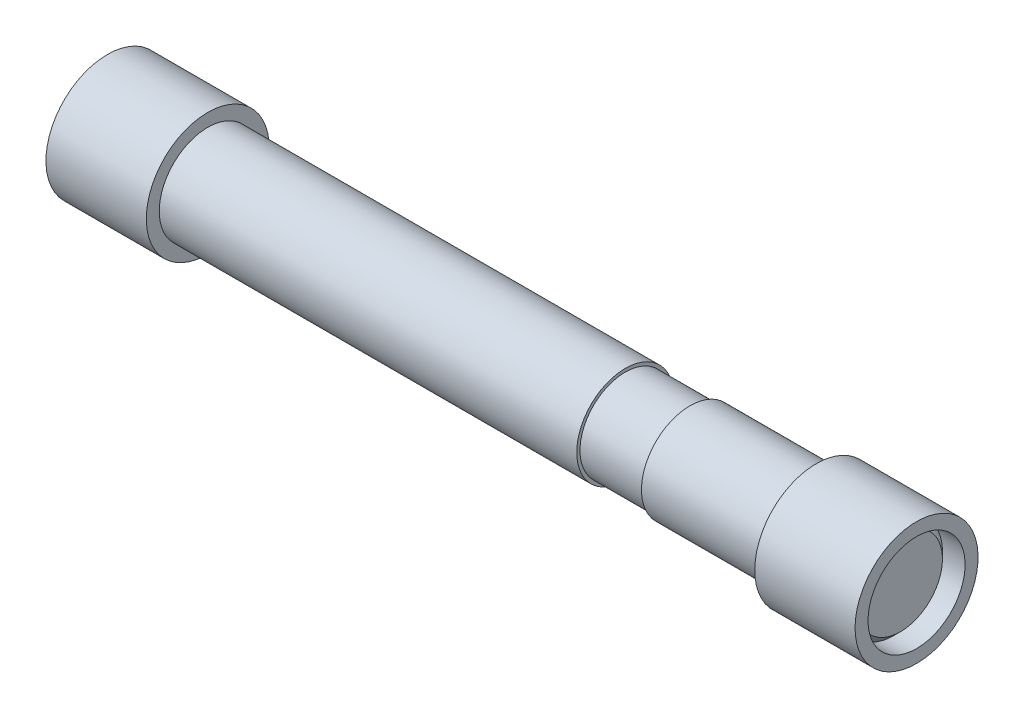
ISO-10303-21;
HEADER;
FILE_DESCRIPTION(('STEP AP214'),'2;1');
FILE_NAME('part.step','',(''),(''),'','','');
FILE_SCHEMA(('AUTOMOTIVE_DESIGN { 1 0 10303 214 1 1 1 1 }'));
ENDSEC;
DATA;
#1=APPLICATION_CONTEXT('core data for automotive mechanical design processes');
#2=APPLICATION_PROTOCOL_DEFINITION('international standard','automotive_design',2000,#1);
#3=PRODUCT_CONTEXT('',#1,'mechanical');
#4=PRODUCT('Part','Part','',(#3));
#5=PRODUCT_RELATED_PRODUCT_CATEGORY('part','',(#4));
#6=PRODUCT_DEFINITION_FORMATION('','',#4);
#7=PRODUCT_DEFINITION_CONTEXT('part definition',#1,'design');
#8=PRODUCT_DEFINITION('design','',#6,#7);
#9=PRODUCT_DEFINITION_SHAPE('','',#8);
#10=(LENGTH_UNIT() NAMED_UNIT(*) SI_UNIT(.MILLI.,.METRE.));
#11=(NAMED_UNIT(*) PLANE_ANGLE_UNIT() SI_UNIT($,.RADIAN.));
#12=(NAMED_UNIT(*) SI_UNIT($,.STERADIAN.) SOLID_ANGLE_UNIT());
#13=UNCERTAINTY_MEASURE_WITH_UNIT(LENGTH_MEASURE(1.E-05),#10,'distance_accuracy_value','');
#14=(GEOMETRIC_REPRESENTATION_CONTEXT(3) GLOBAL_UNCERTAINTY_ASSIGNED_CONTEXT((#13)) GLOBAL_UNIT_ASSIGNED_CONTEXT((#10,
#11,#12)) REPRESENTATION_CONTEXT('',''));
#15=CARTESIAN_POINT('',(0.,0.,0.));
#16=DIRECTION('',(0.,0.,1.));
#17=DIRECTION('',(1.,0.,0.));
#18=AXIS2_PLACEMENT_3D('',#15,#16,#17);
#19=CARTESIAN_POINT('',(-12.,-40.,79.));
#20=DIRECTION('',(1.,0.,0.));
#21=DIRECTION('',(0.,0.,-1.));
#22=AXIS2_PLACEMENT_3D('',#19,#20,#21);
#23=PLANE('',#22);
#24=CARTESIAN_POINT('',(-12.,-40.,79.));
#25=DIRECTION('',(-1.,0.,0.));
#26=DIRECTION('',(0.,-0.999619661356127,-0.0275777560773577));
#27=AXIS2_PLACEMENT_3D('',#24,#25,#26);
#28=CIRCLE('',#27,1.3);
#29=CARTESIAN_POINT('',(-12.,-41.2995055597629,78.9641489170995));
#30=VERTEX_POINT('',#29);
#31=EDGE_CURVE('E11',#30,#30,#28,.T.);
#32=ORIENTED_EDGE('',*,*,#31,.T.);
#33=EDGE_LOOP('',(#32));
#34=FACE_BOUND('',#33,.T.);
#35=ADVANCED_FACE('F36',(#34),#23,.F.);
#36=CARTESIAN_POINT('',(-11.8,-40.,79.));
#37=DIRECTION('',(1.,0.,0.));
#38=DIRECTION('',(0.,-0.999619661356127,-0.027577756077359));
#39=AXIS2_PLACEMENT_3D('',#36,#37,#38);
#40=CONICAL_SURFACE('',#39,1.5,0.785398163397453);
#41=ORIENTED_EDGE('',*,*,#31,.F.);
#42=EDGE_LOOP('',(#41));
#43=FACE_BOUND('',#42,.T.);
#44=CARTESIAN_POINT('',(-11.8,-40.,79.));
#45=DIRECTION('',(1.,0.,0.));
#46=DIRECTION('',(0.,-0.999619661356127,-0.027577756077359));
#47=AXIS2_PLACEMENT_3D('',#44,#45,#46);
#48=CIRCLE('',#47,1.5);
#49=CARTESIAN_POINT('',(-11.8,-41.4994294920342,78.958633365884));
#50=VERTEX_POINT('',#49);
#51=EDGE_CURVE('E159',#50,#50,#48,.T.);
#52=ORIENTED_EDGE('',*,*,#51,.F.);
#53=EDGE_LOOP('',(#52));
#54=FACE_BOUND('',#53,.T.);
#55=ADVANCED_FACE('F205',(#43,#54),#40,.T.);
#56=CARTESIAN_POINT('',(12.,-40.,79.));
#57=DIRECTION('',(-1.,0.,0.));
#58=DIRECTION('',(0.,0.999619661356127,0.027577756077359));
#59=AXIS2_PLACEMENT_3D('',#56,#57,#58);
#60=CYLINDRICAL_SURFACE('',#59,1.5);
#61=CARTESIAN_POINT('',(3.50000000000006,-40.,79.));
#62=DIRECTION('',(-1.,0.,0.));
#63=DIRECTION('',(0.,0.999619661356127,0.027577756077359));
#64=AXIS2_PLACEMENT_3D('',#61,#62,#63);
#65=CIRCLE('',#64,1.5);
#66=CARTESIAN_POINT('',(3.50000000000006,-38.5005705079657,79.0413666341161));
#67=VERTEX_POINT('',#66);
#68=EDGE_CURVE('E130',#67,#67,#65,.T.);
#69=ORIENTED_EDGE('',*,*,#68,.T.);
#70=EDGE_LOOP('',(#69));
#71=FACE_BOUND('',#70,.T.);
#72=CARTESIAN_POINT('',(-9.4,-40.,79.));
#73=DIRECTION('',(-1.,0.,0.));
#74=DIRECTION('',(0.,0.746654905866277,-0.66521158404362));
#75=AXIS2_PLACEMENT_3D('',#72,#73,#74);
#76=CIRCLE('',#75,1.5);
#77=CARTESIAN_POINT('',(-9.4,-38.8800176412005,78.0021826239346));
#78=VERTEX_POINT('',#77);
#79=EDGE_CURVE('E149',#78,#78,#76,.T.);
#80=ORIENTED_EDGE('',*,*,#79,.F.);
#81=EDGE_LOOP('',(#80));
#82=FACE_BOUND('',#81,.T.);
#83=ADVANCED_FACE('F273',(#71,#82),#60,.T.);
#84=CARTESIAN_POINT('',(12.5,-40.,79.));
#85=DIRECTION('',(1.,0.,0.));
#86=DIRECTION('',(0.,0.,-1.));
#87=AXIS2_PLACEMENT_3D('',#84,#85,#86);
#88=PLANE('',#87);
#89=CARTESIAN_POINT('',(12.5,-40.,79.));
#90=DIRECTION('',(1.,0.,0.));
#91=DIRECTION('',(0.,-0.746654905866277,0.66521158404362));
#92=AXIS2_PLACEMENT_3D('',#89,#90,#91);
#93=CIRCLE('',#92,1.5);
#94=CARTESIAN_POINT('',(12.5,-41.1199823587993,79.9978173760655));
#95=VERTEX_POINT('',#94);
#96=EDGE_CURVE('E47',#95,#95,#93,.T.);
#97=ORIENTED_EDGE('',*,*,#96,.F.);
#98=EDGE_LOOP('',(#97));
#99=FACE_BOUND('',#98,.T.);
#100=CARTESIAN_POINT('',(12.5,-40.,79.));
#101=DIRECTION('',(1.,0.,0.));
#102=DIRECTION('',(0.,-0.746654905866277,0.66521158404362));
#103=AXIS2_PLACEMENT_3D('',#100,#101,#102);
#104=CIRCLE('',#103,1.9);
#105=CARTESIAN_POINT('',(12.5,-41.4186443211459,80.2639020096829));
#106=VERTEX_POINT('',#105);
#107=EDGE_CURVE('E123',#106,#106,#104,.T.);
#108=ORIENTED_EDGE('',*,*,#107,.T.);
#109=EDGE_LOOP('',(#108));
#110=FACE_BOUND('',#109,.T.);
#111=ADVANCED_FACE('F214',(#99,#110),#88,.T.);
#112=CARTESIAN_POINT('',(12.5,-40.,79.));
#113=DIRECTION('',(-1.,0.,0.));
#114=DIRECTION('',(0.,0.746654905866277,-0.66521158404362));
#115=AXIS2_PLACEMENT_3D('',#112,#113,#114);
#116=CYLINDRICAL_SURFACE('',#115,1.5);
#117=CARTESIAN_POINT('',(11.8,-40.,79.));
#118=DIRECTION('',(1.,0.,0.));
#119=DIRECTION('',(0.,0.,1.));
#120=AXIS2_PLACEMENT_3D('',#117,#118,#119);
#121=CIRCLE('',#120,1.5);
#122=CARTESIAN_POINT('',(11.8,-40.,80.5));
#123=VERTEX_POINT('',#122);
#124=EDGE_CURVE('E133',#123,#123,#121,.T.);
#125=ORIENTED_EDGE('',*,*,#124,.F.);
#126=EDGE_LOOP('',(#125));
#127=FACE_BOUND('',#126,.T.);
#128=ORIENTED_EDGE('',*,*,#96,.T.);
#129=EDGE_LOOP('',(#128));
#130=FACE_BOUND('',#129,.T.);
#131=ADVANCED_FACE('F210',(#127,#130),#116,.F.);
#132=CARTESIAN_POINT('',(9.4,-40.,79.));
#133=DIRECTION('',(1.,0.,0.));
#134=DIRECTION('',(0.,-0.746654905866277,0.66521158404362));
#135=AXIS2_PLACEMENT_3D('',#132,#133,#134);
#136=CYLINDRICAL_SURFACE('',#135,1.9);
#137=CARTESIAN_POINT('',(9.4,-40.,79.));
#138=DIRECTION('',(1.,0.,0.));
#139=DIRECTION('',(0.,-0.746654905866277,0.66521158404362));
#140=AXIS2_PLACEMENT_3D('',#137,#138,#139);
#141=CIRCLE('',#140,1.9);
#142=CARTESIAN_POINT('',(9.4,-41.4186443211459,80.2639020096829));
#143=VERTEX_POINT('',#142);
#144=EDGE_CURVE('E119',#143,#143,#141,.T.);
#145=ORIENTED_EDGE('',*,*,#144,.T.);
#146=EDGE_LOOP('',(#145));
#147=FACE_BOUND('',#146,.T.);
#148=ORIENTED_EDGE('',*,*,#107,.F.);
#149=EDGE_LOOP('',(#148));
#150=FACE_BOUND('',#149,.T.);
#151=ADVANCED_FACE('F38',(#147,#150),#136,.T.);
#152=CARTESIAN_POINT('',(9.4,-40.,79.));
#153=DIRECTION('',(1.,0.,0.));
#154=DIRECTION('',(0.,0.,-1.));
#155=AXIS2_PLACEMENT_3D('',#152,#153,#154);
#156=PLANE('',#155);
#157=CARTESIAN_POINT('',(9.4,-40.,79.));
#158=DIRECTION('',(1.,0.,0.));
#159=DIRECTION('',(0.,-0.746654905866277,0.66521158404362));
#160=AXIS2_PLACEMENT_3D('',#157,#158,#159);
#161=CIRCLE('',#160,1.5);
#162=CARTESIAN_POINT('',(9.4,-41.1199823587993,79.9978173760655));
#163=VERTEX_POINT('',#162);
#164=EDGE_CURVE('E40',#163,#163,#161,.T.);
#165=ORIENTED_EDGE('',*,*,#164,.T.);
#166=EDGE_LOOP('',(#165));
#167=FACE_BOUND('',#166,.T.);
#168=ORIENTED_EDGE('',*,*,#144,.F.);
#169=EDGE_LOOP('',(#168));
#170=FACE_BOUND('',#169,.T.);
#171=ADVANCED_FACE('F229',(#167,#170),#156,.F.);
#172=CARTESIAN_POINT('',(5.5,-40.,79.));
#173=DIRECTION('',(-1.,0.,0.));
#174=DIRECTION('',(0.,0.999619661356127,0.0275777560773583));
#175=AXIS2_PLACEMENT_3D('',#172,#173,#174);
#176=CYLINDRICAL_SURFACE('',#175,1.4);
#177=CARTESIAN_POINT('',(5.5,-40.,79.));
#178=DIRECTION('',(-1.,0.,0.));
#179=DIRECTION('',(0.,0.999619661356127,0.0275777560773583));
#180=AXIS2_PLACEMENT_3D('',#177,#178,#179);
#181=CIRCLE('',#180,1.4);
#182=CARTESIAN_POINT('',(5.5,-38.6005324741014,79.0386088585083));
#183=VERTEX_POINT('',#182);
#184=EDGE_CURVE('E138',#183,#183,#181,.T.);
#185=ORIENTED_EDGE('',*,*,#184,.T.);
#186=EDGE_LOOP('',(#185));
#187=FACE_BOUND('',#186,.T.);
#188=CARTESIAN_POINT('',(3.50000000000006,-40.,79.));
#189=DIRECTION('',(-1.,0.,0.));
#190=DIRECTION('',(0.,0.999619661356127,0.0275777560773583));
#191=AXIS2_PLACEMENT_3D('',#188,#189,#190);
#192=CIRCLE('',#191,1.4);
#193=CARTESIAN_POINT('',(3.50000000000006,-38.6005324741014,79.0386088585083));
#194=VERTEX_POINT('',#193);
#195=EDGE_CURVE('E114',#194,#194,#192,.T.);
#196=ORIENTED_EDGE('',*,*,#195,.F.);
#197=EDGE_LOOP('',(#196));
#198=FACE_BOUND('',#197,.T.);
#199=ADVANCED_FACE('F233',(#187,#198),#176,.T.);
#200=CARTESIAN_POINT('',(3.50000000000006,-40.,79.));
#201=DIRECTION('',(-1.,0.,0.));
#202=DIRECTION('',(0.,1.,0.));
#203=AXIS2_PLACEMENT_3D('',#200,#201,#202);
#204=PLANE('',#203);
#205=ORIENTED_EDGE('',*,*,#195,.T.);
#206=EDGE_LOOP('',(#205));
#207=FACE_BOUND('',#206,.T.);
#208=ORIENTED_EDGE('',*,*,#68,.F.);
#209=EDGE_LOOP('',(#208));
#210=FACE_BOUND('',#209,.T.);
#211=ADVANCED_FACE('F242',(#207,#210),#204,.F.);
#212=CARTESIAN_POINT('',(5.5,-40.,79.));
#213=DIRECTION('',(-1.,0.,0.));
#214=DIRECTION('',(0.,1.,0.));
#215=AXIS2_PLACEMENT_3D('',#212,#213,#214);
#216=PLANE('',#215);
#217=ORIENTED_EDGE('',*,*,#184,.F.);
#218=EDGE_LOOP('',(#217));
#219=FACE_BOUND('',#218,.T.);
#220=CARTESIAN_POINT('',(5.5,-40.,79.));
#221=DIRECTION('',(-1.,0.,0.));
#222=DIRECTION('',(0.,0.999619661356127,0.027577756077359));
#223=AXIS2_PLACEMENT_3D('',#220,#221,#222);
#224=CIRCLE('',#223,1.5);
#225=CARTESIAN_POINT('',(5.5,-38.5005705079657,79.0413666341161));
#226=VERTEX_POINT('',#225);
#227=EDGE_CURVE('E84',#226,#226,#224,.T.);
#228=ORIENTED_EDGE('',*,*,#227,.T.);
#229=EDGE_LOOP('',(#228));
#230=FACE_BOUND('',#229,.T.);
#231=ADVANCED_FACE('F238',(#219,#230),#216,.T.);
#232=CARTESIAN_POINT('',(12.,-40.,79.));
#233=DIRECTION('',(-1.,0.,0.));
#234=DIRECTION('',(0.,0.999619661356127,0.027577756077359));
#235=AXIS2_PLACEMENT_3D('',#232,#233,#234);
#236=CYLINDRICAL_SURFACE('',#235,1.5);
#237=ORIENTED_EDGE('',*,*,#227,.F.);
#238=EDGE_LOOP('',(#237));
#239=FACE_BOUND('',#238,.T.);
#240=ORIENTED_EDGE('',*,*,#164,.F.);
#241=EDGE_LOOP('',(#240));
#242=FACE_BOUND('',#241,.T.);
#243=ADVANCED_FACE('F197',(#239,#242),#236,.T.);
#244=CARTESIAN_POINT('',(12.,-40.,79.));
#245=DIRECTION('',(1.,0.,0.));
#246=DIRECTION('',(0.,0.,-1.));
#247=AXIS2_PLACEMENT_3D('',#244,#245,#246);
#248=PLANE('',#247);
#249=CARTESIAN_POINT('',(12.,-40.,79.));
#250=DIRECTION('',(1.,0.,0.));
#251=DIRECTION('',(0.,-0.999619661356127,-0.0275777560773575));
#252=AXIS2_PLACEMENT_3D('',#249,#250,#251);
#253=CIRCLE('',#252,1.3);
#254=CARTESIAN_POINT('',(12.,-41.2995055597629,78.9641489170995));
#255=VERTEX_POINT('',#254);
#256=EDGE_CURVE('E101',#255,#255,#253,.T.);
#257=ORIENTED_EDGE('',*,*,#256,.T.);
#258=EDGE_LOOP('',(#257));
#259=FACE_BOUND('',#258,.T.);
#260=ADVANCED_FACE('F188',(#259),#248,.T.);
#261=CARTESIAN_POINT('',(12.,-40.,79.));
#262=DIRECTION('',(-1.,0.,0.));
#263=DIRECTION('',(0.,0.999619661356127,0.0275777560773575));
#264=AXIS2_PLACEMENT_3D('',#261,#262,#263);
#265=CONICAL_SURFACE('',#264,1.3,0.785398163397446);
#266=ORIENTED_EDGE('',*,*,#256,.F.);
#267=EDGE_LOOP('',(#266));
#268=FACE_BOUND('',#267,.T.);
#269=ORIENTED_EDGE('',*,*,#124,.T.);
#270=EDGE_LOOP('',(#269));
#271=FACE_BOUND('',#270,.T.);
#272=ADVANCED_FACE('F184',(#268,#271),#265,.T.);
#273=CARTESIAN_POINT('',(-9.4,-40.,79.));
#274=DIRECTION('',(-1.,0.,0.));
#275=DIRECTION('',(0.,0.,1.));
#276=AXIS2_PLACEMENT_3D('',#273,#274,#275);
#277=PLANE('',#276);
#278=ORIENTED_EDGE('',*,*,#79,.T.);
#279=EDGE_LOOP('',(#278));
#280=FACE_BOUND('',#279,.T.);
#281=CARTESIAN_POINT('',(-9.4,-40.,79.));
#282=DIRECTION('',(-1.,0.,0.));
#283=DIRECTION('',(0.,0.746654905866277,-0.66521158404362));
#284=AXIS2_PLACEMENT_3D('',#281,#282,#283);
#285=CIRCLE('',#284,1.9);
#286=CARTESIAN_POINT('',(-9.4,-38.581355678854,77.7360979903172));
#287=VERTEX_POINT('',#286);
#288=EDGE_CURVE('E152',#287,#287,#285,.T.);
#289=ORIENTED_EDGE('',*,*,#288,.F.);
#290=EDGE_LOOP('',(#289));
#291=FACE_BOUND('',#290,.T.);
#292=ADVANCED_FACE('F179',(#280,#291),#277,.F.);
#293=CARTESIAN_POINT('',(-9.4,-40.,79.));
#294=DIRECTION('',(-1.,0.,0.));
#295=DIRECTION('',(0.,0.746654905866277,-0.66521158404362));
#296=AXIS2_PLACEMENT_3D('',#293,#294,#295);
#297=CYLINDRICAL_SURFACE('',#296,1.9);
#298=ORIENTED_EDGE('',*,*,#288,.T.);
#299=EDGE_LOOP('',(#298));
#300=FACE_BOUND('',#299,.T.);
#301=CARTESIAN_POINT('',(-12.5,-40.,79.));
#302=DIRECTION('',(-1.,0.,0.));
#303=DIRECTION('',(0.,0.746654905866277,-0.66521158404362));
#304=AXIS2_PLACEMENT_3D('',#301,#302,#303);
#305=CIRCLE('',#304,1.9);
#306=CARTESIAN_POINT('',(-12.5,-38.581355678854,77.7360979903172));
#307=VERTEX_POINT('',#306);
#308=EDGE_CURVE('E145',#307,#307,#305,.T.);
#309=ORIENTED_EDGE('',*,*,#308,.F.);
#310=EDGE_LOOP('',(#309));
#311=FACE_BOUND('',#310,.T.);
#312=ADVANCED_FACE('F173',(#300,#311),#297,.T.);
#313=CARTESIAN_POINT('',(-12.5,-40.,79.));
#314=DIRECTION('',(1.,0.,0.));
#315=DIRECTION('',(0.,-0.746654905866277,0.66521158404362));
#316=AXIS2_PLACEMENT_3D('',#313,#314,#315);
#317=CYLINDRICAL_SURFACE('',#316,1.5);
#318=CARTESIAN_POINT('',(-12.5,-40.,79.));
#319=DIRECTION('',(-1.,0.,0.));
#320=DIRECTION('',(0.,0.746654905866277,-0.66521158404362));
#321=AXIS2_PLACEMENT_3D('',#318,#319,#320);
#322=CIRCLE('',#321,1.5);
#323=CARTESIAN_POINT('',(-12.5,-38.8800176412005,78.0021826239346));
#324=VERTEX_POINT('',#323);
#325=EDGE_CURVE('E148',#324,#324,#322,.T.);
#326=ORIENTED_EDGE('',*,*,#325,.T.);
#327=EDGE_LOOP('',(#326));
#328=FACE_BOUND('',#327,.T.);
#329=ORIENTED_EDGE('',*,*,#51,.T.);
#330=EDGE_LOOP('',(#329));
#331=FACE_BOUND('',#330,.T.);
#332=ADVANCED_FACE('F178',(#328,#331),#317,.F.);
#333=CARTESIAN_POINT('',(-12.5,-40.,79.));
#334=DIRECTION('',(-1.,0.,0.));
#335=DIRECTION('',(0.,0.,1.));
#336=AXIS2_PLACEMENT_3D('',#333,#334,#335);
#337=PLANE('',#336);
#338=ORIENTED_EDGE('',*,*,#325,.F.);
#339=EDGE_LOOP('',(#338));
#340=FACE_BOUND('',#339,.T.);
#341=ORIENTED_EDGE('',*,*,#308,.T.);
#342=EDGE_LOOP('',(#341));
#343=FACE_BOUND('',#342,.T.);
#344=ADVANCED_FACE('F220',(#340,#343),#337,.T.);
#345=CLOSED_SHELL('',(#35,#55,#83,#111,#131,#151,#171,#199,#211,#231,#243,#260,#272,#292,#312,
#332,#344));
#346=MANIFOLD_SOLID_BREP('B2',#345);
#347=ADVANCED_BREP_SHAPE_REPRESENTATION('',(#18,#346),#14);
#348=SHAPE_DEFINITION_REPRESENTATION(#9,#347);
ENDSEC;
END-ISO-10303-21;
